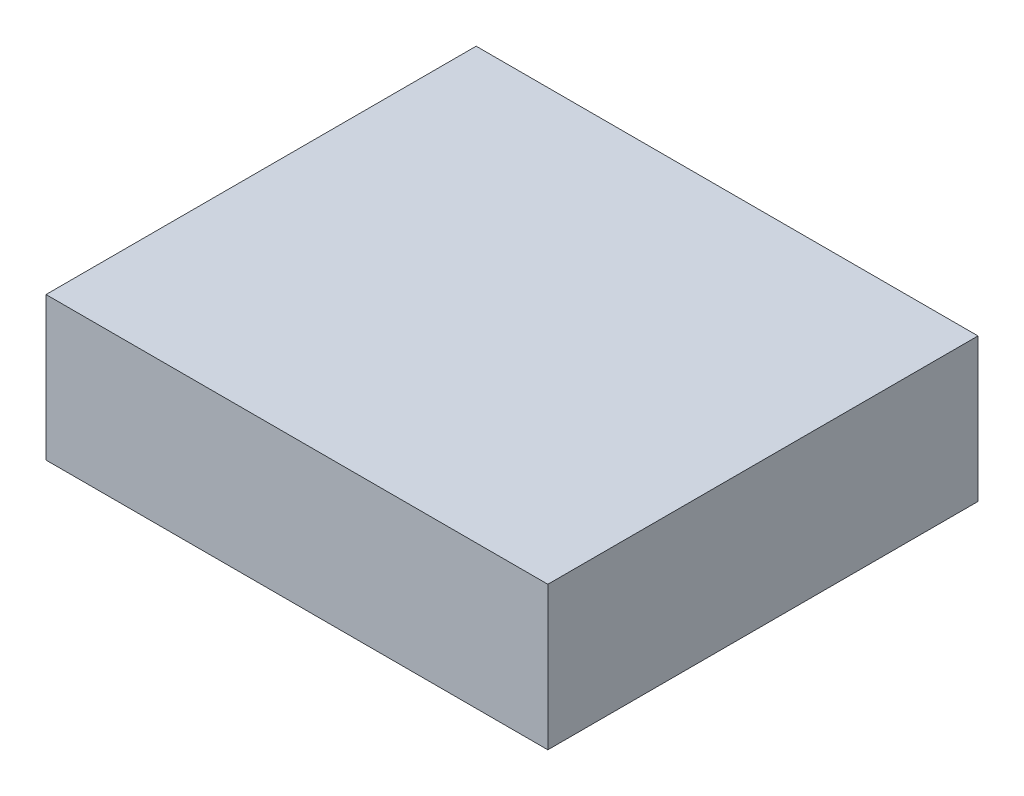
ISO-10303-21;
HEADER;
FILE_DESCRIPTION(('STEP AP214'),'2;1');
FILE_NAME('part.step','',(''),(''),'','','');
FILE_SCHEMA(('AUTOMOTIVE_DESIGN { 1 0 10303 214 1 1 1 1 }'));
ENDSEC;
DATA;
#1=APPLICATION_CONTEXT('core data for automotive mechanical design processes');
#2=APPLICATION_PROTOCOL_DEFINITION('international standard','automotive_design',2000,#1);
#3=PRODUCT_CONTEXT('',#1,'mechanical');
#4=PRODUCT('Part','Part','',(#3));
#5=PRODUCT_RELATED_PRODUCT_CATEGORY('part','',(#4));
#6=PRODUCT_DEFINITION_FORMATION('','',#4);
#7=PRODUCT_DEFINITION_CONTEXT('part definition',#1,'design');
#8=PRODUCT_DEFINITION('design','',#6,#7);
#9=PRODUCT_DEFINITION_SHAPE('','',#8);
#10=(LENGTH_UNIT() NAMED_UNIT(*) SI_UNIT(.MILLI.,.METRE.));
#11=(NAMED_UNIT(*) PLANE_ANGLE_UNIT() SI_UNIT($,.RADIAN.));
#12=(NAMED_UNIT(*) SI_UNIT($,.STERADIAN.) SOLID_ANGLE_UNIT());
#13=UNCERTAINTY_MEASURE_WITH_UNIT(LENGTH_MEASURE(1.E-05),#10,'distance_accuracy_value','');
#14=(GEOMETRIC_REPRESENTATION_CONTEXT(3) GLOBAL_UNCERTAINTY_ASSIGNED_CONTEXT((#13)) GLOBAL_UNIT_ASSIGNED_CONTEXT((#10,
#11,#12)) REPRESENTATION_CONTEXT('',''));
#15=CARTESIAN_POINT('',(0.,0.,0.));
#16=DIRECTION('',(0.,0.,1.));
#17=DIRECTION('',(1.,0.,0.));
#18=AXIS2_PLACEMENT_3D('',#15,#16,#17);
#19=CARTESIAN_POINT('',(-74.6871473354232,50.8,121.651933124347));
#20=DIRECTION('',(0.,0.,-1.));
#21=DIRECTION('',(-1.,0.,0.));
#22=AXIS2_PLACEMENT_3D('',#19,#20,#21);
#23=PLANE('',#22);
#24=DIRECTION('',(1.,0.,0.));
#25=VECTOR('',#24,1.);
#26=CARTESIAN_POINT('',(-74.6871473354232,0.,121.651933124347));
#27=LINE('',#26,#25);
#28=CARTESIAN_POINT('',(-74.6871473354232,0.,121.651933124347));
#29=VERTEX_POINT('',#28);
#30=CARTESIAN_POINT('',(103.112852664577,0.,121.651933124347));
#31=VERTEX_POINT('',#30);
#32=EDGE_CURVE('E106',#29,#31,#27,.T.);
#33=ORIENTED_EDGE('',*,*,#32,.T.);
#34=DIRECTION('',(0.,-1.,0.));
#35=VECTOR('',#34,1.);
#36=CARTESIAN_POINT('',(103.112852664577,50.8,121.651933124347));
#37=LINE('',#36,#35);
#38=CARTESIAN_POINT('',(103.112852664577,50.8,121.651933124347));
#39=VERTEX_POINT('',#38);
#40=EDGE_CURVE('E11',#39,#31,#37,.T.);
#41=ORIENTED_EDGE('',*,*,#40,.F.);
#42=DIRECTION('',(1.,0.,0.));
#43=VECTOR('',#42,1.);
#44=CARTESIAN_POINT('',(-74.6871473354232,50.8,121.651933124347));
#45=LINE('',#44,#43);
#46=CARTESIAN_POINT('',(-74.6871473354232,50.8,121.651933124347));
#47=VERTEX_POINT('',#46);
#48=EDGE_CURVE('E79',#47,#39,#45,.T.);
#49=ORIENTED_EDGE('',*,*,#48,.F.);
#50=DIRECTION('',(0.,-1.,0.));
#51=VECTOR('',#50,1.);
#52=CARTESIAN_POINT('',(-74.6871473354232,50.8,121.651933124347));
#53=LINE('',#52,#51);
#54=EDGE_CURVE('E102',#47,#29,#53,.T.);
#55=ORIENTED_EDGE('',*,*,#54,.T.);
#56=EDGE_LOOP('',(#33,#41,#49,#55));
#57=FACE_BOUND('',#56,.T.);
#58=ADVANCED_FACE('F39',(#57),#23,.F.);
#59=CARTESIAN_POINT('',(103.112852664577,50.8,-30.7480668756531));
#60=DIRECTION('',(1.,0.,0.));
#61=DIRECTION('',(0.,0.,-1.));
#62=AXIS2_PLACEMENT_3D('',#59,#60,#61);
#63=PLANE('',#62);
#64=DIRECTION('',(0.,0.,1.));
#65=VECTOR('',#64,1.);
#66=CARTESIAN_POINT('',(103.112852664577,0.,-30.7480668756531));
#67=LINE('',#66,#65);
#68=CARTESIAN_POINT('',(103.112852664577,0.,-30.7480668756531));
#69=VERTEX_POINT('',#68);
#70=EDGE_CURVE('E88',#69,#31,#67,.T.);
#71=ORIENTED_EDGE('',*,*,#70,.F.);
#72=DIRECTION('',(0.,-1.,0.));
#73=VECTOR('',#72,1.);
#74=CARTESIAN_POINT('',(103.112852664577,50.8,-30.7480668756531));
#75=LINE('',#74,#73);
#76=CARTESIAN_POINT('',(103.112852664577,50.8,-30.7480668756531));
#77=VERTEX_POINT('',#76);
#78=EDGE_CURVE('E48',#77,#69,#75,.T.);
#79=ORIENTED_EDGE('',*,*,#78,.F.);
#80=DIRECTION('',(0.,0.,1.));
#81=VECTOR('',#80,1.);
#82=CARTESIAN_POINT('',(103.112852664577,50.8,-30.7480668756531));
#83=LINE('',#82,#81);
#84=EDGE_CURVE('E86',#77,#39,#83,.T.);
#85=ORIENTED_EDGE('',*,*,#84,.T.);
#86=ORIENTED_EDGE('',*,*,#40,.T.);
#87=EDGE_LOOP('',(#71,#79,#85,#86));
#88=FACE_BOUND('',#87,.T.);
#89=ADVANCED_FACE('F85',(#88),#63,.T.);
#90=CARTESIAN_POINT('',(-74.6871473354232,50.8,-30.7480668756531));
#91=DIRECTION('',(0.,0.,-1.));
#92=DIRECTION('',(-1.,0.,0.));
#93=AXIS2_PLACEMENT_3D('',#90,#91,#92);
#94=PLANE('',#93);
#95=DIRECTION('',(1.,0.,0.));
#96=VECTOR('',#95,1.);
#97=CARTESIAN_POINT('',(-74.6871473354232,0.,-30.7480668756531));
#98=LINE('',#97,#96);
#99=CARTESIAN_POINT('',(-74.6871473354232,0.,-30.7480668756531));
#100=VERTEX_POINT('',#99);
#101=EDGE_CURVE('E112',#100,#69,#98,.T.);
#102=ORIENTED_EDGE('',*,*,#101,.F.);
#103=DIRECTION('',(0.,-1.,0.));
#104=VECTOR('',#103,1.);
#105=CARTESIAN_POINT('',(-74.6871473354232,50.8,-30.7480668756531));
#106=LINE('',#105,#104);
#107=CARTESIAN_POINT('',(-74.6871473354232,50.8,-30.7480668756531));
#108=VERTEX_POINT('',#107);
#109=EDGE_CURVE('E71',#108,#100,#106,.T.);
#110=ORIENTED_EDGE('',*,*,#109,.F.);
#111=DIRECTION('',(1.,0.,0.));
#112=VECTOR('',#111,1.);
#113=CARTESIAN_POINT('',(-74.6871473354232,50.8,-30.7480668756531));
#114=LINE('',#113,#112);
#115=EDGE_CURVE('E95',#108,#77,#114,.T.);
#116=ORIENTED_EDGE('',*,*,#115,.T.);
#117=ORIENTED_EDGE('',*,*,#78,.T.);
#118=EDGE_LOOP('',(#102,#110,#116,#117));
#119=FACE_BOUND('',#118,.T.);
#120=ADVANCED_FACE('F98',(#119),#94,.T.);
#121=CARTESIAN_POINT('',(-74.6871473354232,50.8,-30.7480668756531));
#122=DIRECTION('',(1.,0.,0.));
#123=DIRECTION('',(0.,0.,-1.));
#124=AXIS2_PLACEMENT_3D('',#121,#122,#123);
#125=PLANE('',#124);
#126=DIRECTION('',(0.,0.,1.));
#127=VECTOR('',#126,1.);
#128=CARTESIAN_POINT('',(-74.6871473354232,0.,-30.7480668756531));
#129=LINE('',#128,#127);
#130=EDGE_CURVE('E74',#100,#29,#129,.T.);
#131=ORIENTED_EDGE('',*,*,#130,.T.);
#132=ORIENTED_EDGE('',*,*,#54,.F.);
#133=DIRECTION('',(0.,0.,1.));
#134=VECTOR('',#133,1.);
#135=CARTESIAN_POINT('',(-74.6871473354232,50.8,-30.7480668756531));
#136=LINE('',#135,#134);
#137=EDGE_CURVE('E56',#108,#47,#136,.T.);
#138=ORIENTED_EDGE('',*,*,#137,.F.);
#139=ORIENTED_EDGE('',*,*,#109,.T.);
#140=EDGE_LOOP('',(#131,#132,#138,#139));
#141=FACE_BOUND('',#140,.T.);
#142=ADVANCED_FACE('F129',(#141),#125,.F.);
#143=CARTESIAN_POINT('',(0.,50.8,0.));
#144=DIRECTION('',(0.,-1.,0.));
#145=DIRECTION('',(0.,0.,-1.));
#146=AXIS2_PLACEMENT_3D('',#143,#144,#145);
#147=PLANE('',#146);
#148=ORIENTED_EDGE('',*,*,#48,.T.);
#149=ORIENTED_EDGE('',*,*,#84,.F.);
#150=ORIENTED_EDGE('',*,*,#115,.F.);
#151=ORIENTED_EDGE('',*,*,#137,.T.);
#152=EDGE_LOOP('',(#148,#149,#150,#151));
#153=FACE_BOUND('',#152,.T.);
#154=ADVANCED_FACE('F94',(#153),#147,.F.);
#155=CARTESIAN_POINT('',(0.,0.,0.));
#156=DIRECTION('',(0.,-1.,0.));
#157=DIRECTION('',(0.,0.,-1.));
#158=AXIS2_PLACEMENT_3D('',#155,#156,#157);
#159=PLANE('',#158);
#160=ORIENTED_EDGE('',*,*,#32,.F.);
#161=ORIENTED_EDGE('',*,*,#130,.F.);
#162=ORIENTED_EDGE('',*,*,#101,.T.);
#163=ORIENTED_EDGE('',*,*,#70,.T.);
#164=EDGE_LOOP('',(#160,#161,#162,#163));
#165=FACE_BOUND('',#164,.T.);
#166=ADVANCED_FACE('F123',(#165),#159,.T.);
#167=CLOSED_SHELL('',(#58,#89,#120,#142,#154,#166));
#168=MANIFOLD_SOLID_BREP('B2',#167);
#169=ADVANCED_BREP_SHAPE_REPRESENTATION('',(#18,#168),#14);
#170=SHAPE_DEFINITION_REPRESENTATION(#9,#169);
ENDSEC;
END-ISO-10303-21;
